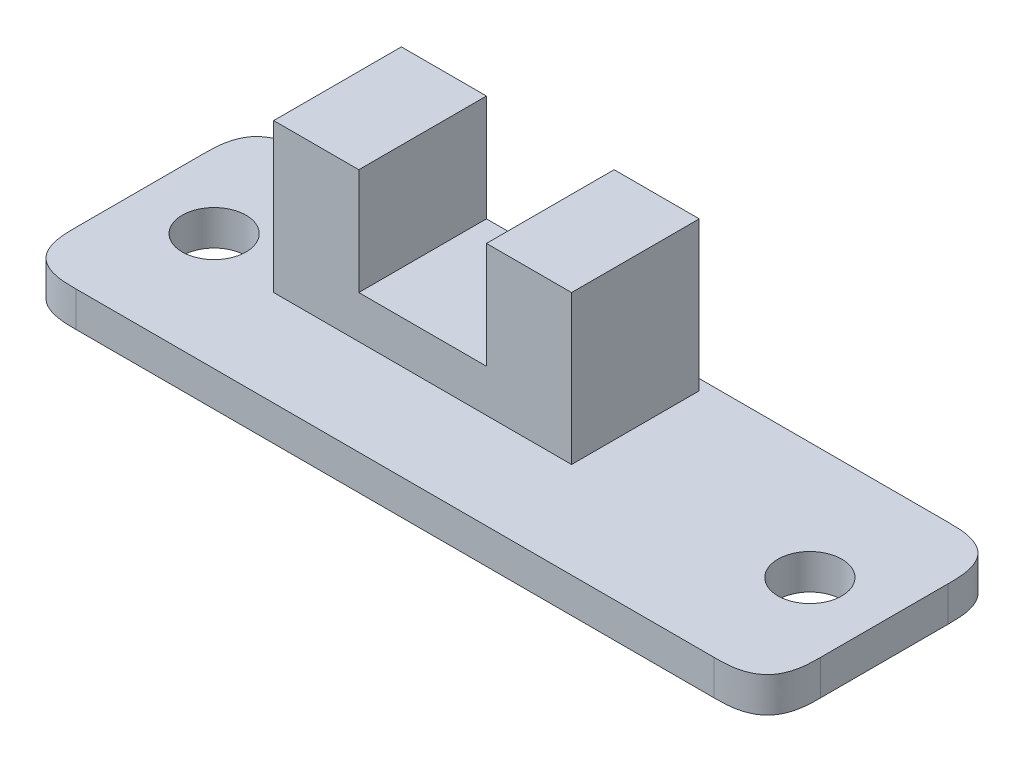
ISO-10303-21;
HEADER;
FILE_DESCRIPTION(('STEP AP214'),'2;1');
FILE_NAME('part.step','',(''),(''),'','','');
FILE_SCHEMA(('AUTOMOTIVE_DESIGN { 1 0 10303 214 1 1 1 1 }'));
ENDSEC;
DATA;
#1=APPLICATION_CONTEXT('core data for automotive mechanical design processes');
#2=APPLICATION_PROTOCOL_DEFINITION('international standard','automotive_design',2000,#1);
#3=PRODUCT_CONTEXT('',#1,'mechanical');
#4=PRODUCT('Part','Part','',(#3));
#5=PRODUCT_RELATED_PRODUCT_CATEGORY('part','',(#4));
#6=PRODUCT_DEFINITION_FORMATION('','',#4);
#7=PRODUCT_DEFINITION_CONTEXT('part definition',#1,'design');
#8=PRODUCT_DEFINITION('design','',#6,#7);
#9=PRODUCT_DEFINITION_SHAPE('','',#8);
#10=(LENGTH_UNIT() NAMED_UNIT(*) SI_UNIT(.MILLI.,.METRE.));
#11=(NAMED_UNIT(*) PLANE_ANGLE_UNIT() SI_UNIT($,.RADIAN.));
#12=(NAMED_UNIT(*) SI_UNIT($,.STERADIAN.) SOLID_ANGLE_UNIT());
#13=UNCERTAINTY_MEASURE_WITH_UNIT(LENGTH_MEASURE(1.E-05),#10,'distance_accuracy_value','');
#14=(GEOMETRIC_REPRESENTATION_CONTEXT(3) GLOBAL_UNCERTAINTY_ASSIGNED_CONTEXT((#13)) GLOBAL_UNIT_ASSIGNED_CONTEXT((#10,
#11,#12)) REPRESENTATION_CONTEXT('',''));
#15=CARTESIAN_POINT('',(0.,0.,0.));
#16=DIRECTION('',(0.,0.,1.));
#17=DIRECTION('',(1.,0.,0.));
#18=AXIS2_PLACEMENT_3D('',#15,#16,#17);
#19=CARTESIAN_POINT('',(0.,1.65,0.));
#20=DIRECTION('',(0.,-1.,0.));
#21=DIRECTION('',(0.,0.,-1.));
#22=AXIS2_PLACEMENT_3D('',#19,#20,#21);
#23=PLANE('',#22);
#24=DIRECTION('',(1.,0.,0.));
#25=VECTOR('',#24,1.);
#26=CARTESIAN_POINT('',(0.,1.65,-10.5));
#27=LINE('',#26,#25);
#28=CARTESIAN_POINT('',(7.3,1.65,-10.5));
#29=VERTEX_POINT('',#28);
#30=CARTESIAN_POINT('',(21.3,1.65,-10.5));
#31=VERTEX_POINT('',#30);
#32=EDGE_CURVE('E98',#29,#31,#27,.T.);
#33=ORIENTED_EDGE('',*,*,#32,.T.);
#34=DIRECTION('',(0.,0.,1.));
#35=VECTOR('',#34,1.);
#36=CARTESIAN_POINT('',(21.3,1.65,0.));
#37=LINE('',#36,#35);
#38=CARTESIAN_POINT('',(21.3,1.65,-4.5));
#39=VERTEX_POINT('',#38);
#40=EDGE_CURVE('E237',#31,#39,#37,.T.);
#41=ORIENTED_EDGE('',*,*,#40,.T.);
#42=DIRECTION('',(1.,0.,0.));
#43=VECTOR('',#42,1.);
#44=CARTESIAN_POINT('',(0.,1.65,-4.5));
#45=LINE('',#44,#43);
#46=CARTESIAN_POINT('',(7.3,1.65,-4.5));
#47=VERTEX_POINT('',#46);
#48=EDGE_CURVE('E243',#47,#39,#45,.T.);
#49=ORIENTED_EDGE('',*,*,#48,.F.);
#50=DIRECTION('',(0.,0.,1.));
#51=VECTOR('',#50,1.);
#52=CARTESIAN_POINT('',(7.3,1.65,0.));
#53=LINE('',#52,#51);
#54=EDGE_CURVE('E246',#29,#47,#53,.T.);
#55=ORIENTED_EDGE('',*,*,#54,.F.);
#56=EDGE_LOOP('',(#33,#41,#49,#55));
#57=FACE_BOUND('',#56,.T.);
#58=DIRECTION('',(1.,0.,0.));
#59=VECTOR('',#58,1.);
#60=CARTESIAN_POINT('',(0.,1.65,-11.));
#61=LINE('',#60,#59);
#62=CARTESIAN_POINT('',(2.5,1.65,-11.));
#63=VERTEX_POINT('',#62);
#64=CARTESIAN_POINT('',(32.5,1.65,-11.));
#65=VERTEX_POINT('',#64);
#66=EDGE_CURVE('E282',#63,#65,#61,.T.);
#67=ORIENTED_EDGE('',*,*,#66,.F.);
#68=CARTESIAN_POINT('',(0.,1.65,-8.5));
#69=CARTESIAN_POINT('',(0.,1.65,-8.92049512883487));
#70=CARTESIAN_POINT('',(0.,1.65,-9.34099025766973));
#71=CARTESIAN_POINT('',(0.179229799590208,1.65,-10.2677669529664));
#72=CARTESIAN_POINT('',(0.732233047033631,1.65,-10.8207702004098));
#73=CARTESIAN_POINT('',(1.65900974233027,1.65,-11.));
#74=CARTESIAN_POINT('',(2.07950487116513,1.65,-11.));
#75=CARTESIAN_POINT('',(2.5,1.65,-11.));
#76=B_SPLINE_CURVE_WITH_KNOTS('',5,(#68,#69,#70,#71,#72,#73,#74,#75),.UNSPECIFIED.,.F.,.F.,(6,2,
6),(0.,0.5,1.),.UNSPECIFIED.);
#77=CARTESIAN_POINT('',(0.,1.65,-8.5));
#78=VERTEX_POINT('',#77);
#79=EDGE_CURVE('E465',#63,#78,#76,.F.);
#80=ORIENTED_EDGE('',*,*,#79,.T.);
#81=DIRECTION('',(0.,0.,-1.));
#82=VECTOR('',#81,1.);
#83=CARTESIAN_POINT('',(0.,1.65,0.));
#84=LINE('',#83,#82);
#85=CARTESIAN_POINT('',(0.,1.65,-2.5));
#86=VERTEX_POINT('',#85);
#87=EDGE_CURVE('E278',#86,#78,#84,.T.);
#88=ORIENTED_EDGE('',*,*,#87,.F.);
#89=CARTESIAN_POINT('',(2.5,1.65,0.));
#90=CARTESIAN_POINT('',(2.07950487116513,1.65,0.));
#91=CARTESIAN_POINT('',(1.65900974233027,1.65,0.));
#92=CARTESIAN_POINT('',(0.732233047033631,1.65,-0.179229799590208));
#93=CARTESIAN_POINT('',(0.179229799590208,1.65,-0.732233047033631));
#94=CARTESIAN_POINT('',(0.,1.65,-1.65900974233027));
#95=CARTESIAN_POINT('',(0.,1.65,-2.07950487116513));
#96=CARTESIAN_POINT('',(0.,1.65,-2.5));
#97=B_SPLINE_CURVE_WITH_KNOTS('',5,(#89,#90,#91,#92,#93,#94,#95,#96),.UNSPECIFIED.,.F.,.F.,(6,2,
6),(0.,0.5,1.),.UNSPECIFIED.);
#98=CARTESIAN_POINT('',(2.5,1.65,0.));
#99=VERTEX_POINT('',#98);
#100=EDGE_CURVE('E442',#86,#99,#97,.F.);
#101=ORIENTED_EDGE('',*,*,#100,.T.);
#102=DIRECTION('',(1.,0.,0.));
#103=VECTOR('',#102,1.);
#104=CARTESIAN_POINT('',(0.,1.65,0.));
#105=LINE('',#104,#103);
#106=CARTESIAN_POINT('',(32.5,1.65,0.));
#107=VERTEX_POINT('',#106);
#108=EDGE_CURVE('E415',#99,#107,#105,.T.);
#109=ORIENTED_EDGE('',*,*,#108,.T.);
#110=CARTESIAN_POINT('',(35.,1.65,-2.5));
#111=CARTESIAN_POINT('',(35.,1.65,-2.07950487116513));
#112=CARTESIAN_POINT('',(35.,1.65,-1.65900974233027));
#113=CARTESIAN_POINT('',(34.8207702004098,1.65,-0.732233047033631));
#114=CARTESIAN_POINT('',(34.2677669529664,1.65,-0.179229799590209));
#115=CARTESIAN_POINT('',(33.3409902576697,1.65,0.));
#116=CARTESIAN_POINT('',(32.9204951288349,1.65,0.));
#117=CARTESIAN_POINT('',(32.5,1.65,0.));
#118=B_SPLINE_CURVE_WITH_KNOTS('',5,(#110,#111,#112,#113,#114,#115,#116,#117),.UNSPECIFIED.,.F.,
.F.,(6,2,6),(0.,0.5,1.),.UNSPECIFIED.);
#119=CARTESIAN_POINT('',(35.,1.65,-2.5));
#120=VERTEX_POINT('',#119);
#121=EDGE_CURVE('E430',#107,#120,#118,.F.);
#122=ORIENTED_EDGE('',*,*,#121,.T.);
#123=DIRECTION('',(0.,0.,-1.));
#124=VECTOR('',#123,1.);
#125=CARTESIAN_POINT('',(35.,1.65,0.));
#126=LINE('',#125,#124);
#127=CARTESIAN_POINT('',(35.,1.65,-8.5));
#128=VERTEX_POINT('',#127);
#129=EDGE_CURVE('E394',#120,#128,#126,.T.);
#130=ORIENTED_EDGE('',*,*,#129,.T.);
#131=CARTESIAN_POINT('',(32.5,1.65,-11.));
#132=CARTESIAN_POINT('',(32.9204951288349,1.65,-11.));
#133=CARTESIAN_POINT('',(33.3409902576697,1.65,-11.));
#134=CARTESIAN_POINT('',(34.2677669529664,1.65,-10.8207702004098));
#135=CARTESIAN_POINT('',(34.8207702004098,1.65,-10.2677669529664));
#136=CARTESIAN_POINT('',(35.,1.65,-9.34099025766973));
#137=CARTESIAN_POINT('',(35.,1.65,-8.92049512883487));
#138=CARTESIAN_POINT('',(35.,1.65,-8.5));
#139=B_SPLINE_CURVE_WITH_KNOTS('',5,(#131,#132,#133,#134,#135,#136,#137,#138),.UNSPECIFIED.,.F.,
.F.,(6,2,6),(0.,0.5,1.),.UNSPECIFIED.);
#140=EDGE_CURVE('E454',#128,#65,#139,.F.);
#141=ORIENTED_EDGE('',*,*,#140,.T.);
#142=EDGE_LOOP('',(#67,#80,#88,#101,#109,#122,#130,#141));
#143=FACE_BOUND('',#142,.T.);
#144=CARTESIAN_POINT('',(3.5,1.65,-5.5));
#145=DIRECTION('',(0.,1.,0.));
#146=DIRECTION('',(0.,0.,1.));
#147=AXIS2_PLACEMENT_3D('',#144,#145,#146);
#148=CIRCLE('',#147,1.5);
#149=CARTESIAN_POINT('',(3.5,1.65,-4.));
#150=VERTEX_POINT('',#149);
#151=EDGE_CURVE('E267',#150,#150,#148,.T.);
#152=ORIENTED_EDGE('',*,*,#151,.F.);
#153=EDGE_LOOP('',(#152));
#154=FACE_BOUND('',#153,.T.);
#155=CARTESIAN_POINT('',(31.5,1.65,-5.5));
#156=DIRECTION('',(0.,1.,0.));
#157=DIRECTION('',(0.,0.,1.));
#158=AXIS2_PLACEMENT_3D('',#155,#156,#157);
#159=CIRCLE('',#158,1.5);
#160=CARTESIAN_POINT('',(31.5,1.65,-4.));
#161=VERTEX_POINT('',#160);
#162=EDGE_CURVE('E261',#161,#161,#159,.T.);
#163=ORIENTED_EDGE('',*,*,#162,.F.);
#164=EDGE_LOOP('',(#163));
#165=FACE_BOUND('',#164,.T.);
#166=ADVANCED_FACE('F69',(#57,#143,#154,#165),#23,.F.);
#167=CARTESIAN_POINT('',(0.,0.,0.));
#168=DIRECTION('',(0.,-1.,0.));
#169=DIRECTION('',(0.,0.,-1.));
#170=AXIS2_PLACEMENT_3D('',#167,#168,#169);
#171=PLANE('',#170);
#172=CARTESIAN_POINT('',(3.5,0.,-5.5));
#173=DIRECTION('',(0.,1.,0.));
#174=DIRECTION('',(0.,0.,1.));
#175=AXIS2_PLACEMENT_3D('',#172,#173,#174);
#176=CIRCLE('',#175,1.5);
#177=CARTESIAN_POINT('',(3.5,0.,-4.));
#178=VERTEX_POINT('',#177);
#179=EDGE_CURVE('E264',#178,#178,#176,.T.);
#180=ORIENTED_EDGE('',*,*,#179,.T.);
#181=EDGE_LOOP('',(#180));
#182=FACE_BOUND('',#181,.T.);
#183=DIRECTION('',(0.,0.,-1.));
#184=VECTOR('',#183,1.);
#185=CARTESIAN_POINT('',(0.,0.,0.));
#186=LINE('',#185,#184);
#187=CARTESIAN_POINT('',(0.,0.,-2.5));
#188=VERTEX_POINT('',#187);
#189=CARTESIAN_POINT('',(0.,0.,-8.5));
#190=VERTEX_POINT('',#189);
#191=EDGE_CURVE('E270',#188,#190,#186,.T.);
#192=ORIENTED_EDGE('',*,*,#191,.T.);
#193=CARTESIAN_POINT('',(2.5,0.,-11.));
#194=CARTESIAN_POINT('',(2.07950487116513,0.,-11.));
#195=CARTESIAN_POINT('',(1.65900974233027,0.,-11.));
#196=CARTESIAN_POINT('',(0.732233047033631,0.,-10.8207702004098));
#197=CARTESIAN_POINT('',(0.179229799590208,0.,-10.2677669529664));
#198=CARTESIAN_POINT('',(0.,0.,-9.34099025766973));
#199=CARTESIAN_POINT('',(0.,0.,-8.92049512883487));
#200=CARTESIAN_POINT('',(0.,0.,-8.5));
#201=B_SPLINE_CURVE_WITH_KNOTS('',5,(#193,#194,#195,#196,#197,#198,#199,#200),.UNSPECIFIED.,.F.,
.F.,(6,2,6),(0.,0.5,1.),.UNSPECIFIED.);
#202=CARTESIAN_POINT('',(2.5,0.,-11.));
#203=VERTEX_POINT('',#202);
#204=EDGE_CURVE('E382',#190,#203,#201,.F.);
#205=ORIENTED_EDGE('',*,*,#204,.T.);
#206=DIRECTION('',(1.,0.,0.));
#207=VECTOR('',#206,1.);
#208=CARTESIAN_POINT('',(0.,0.,-11.));
#209=LINE('',#208,#207);
#210=CARTESIAN_POINT('',(32.5,0.,-11.));
#211=VERTEX_POINT('',#210);
#212=EDGE_CURVE('E323',#203,#211,#209,.T.);
#213=ORIENTED_EDGE('',*,*,#212,.T.);
#214=CARTESIAN_POINT('',(35.,0.,-8.5));
#215=CARTESIAN_POINT('',(35.,0.,-8.92049512883486));
#216=CARTESIAN_POINT('',(35.,0.,-9.34099025766973));
#217=CARTESIAN_POINT('',(34.8207702004098,0.,-10.2677669529664));
#218=CARTESIAN_POINT('',(34.2677669529664,0.,-10.8207702004098));
#219=CARTESIAN_POINT('',(33.3409902576697,0.,-11.));
#220=CARTESIAN_POINT('',(32.9204951288349,0.,-11.));
#221=CARTESIAN_POINT('',(32.5,0.,-11.));
#222=B_SPLINE_CURVE_WITH_KNOTS('',5,(#214,#215,#216,#217,#218,#219,#220,#221),.UNSPECIFIED.,.F.,
.F.,(6,2,6),(0.,0.5,1.),.UNSPECIFIED.);
#223=CARTESIAN_POINT('',(35.,0.,-8.5));
#224=VERTEX_POINT('',#223);
#225=EDGE_CURVE('E564',#211,#224,#222,.F.);
#226=ORIENTED_EDGE('',*,*,#225,.T.);
#227=DIRECTION('',(0.,0.,-1.));
#228=VECTOR('',#227,1.);
#229=CARTESIAN_POINT('',(35.,0.,0.));
#230=LINE('',#229,#228);
#231=CARTESIAN_POINT('',(35.,0.,-2.5));
#232=VERTEX_POINT('',#231);
#233=EDGE_CURVE('E332',#232,#224,#230,.T.);
#234=ORIENTED_EDGE('',*,*,#233,.F.);
#235=CARTESIAN_POINT('',(32.5,0.,0.));
#236=CARTESIAN_POINT('',(32.9204951288349,0.,0.));
#237=CARTESIAN_POINT('',(33.3409902576697,0.,0.));
#238=CARTESIAN_POINT('',(34.2677669529664,0.,-0.179229799590209));
#239=CARTESIAN_POINT('',(34.8207702004098,0.,-0.732233047033631));
#240=CARTESIAN_POINT('',(35.,0.,-1.65900974233027));
#241=CARTESIAN_POINT('',(35.,0.,-2.07950487116513));
#242=CARTESIAN_POINT('',(35.,0.,-2.5));
#243=B_SPLINE_CURVE_WITH_KNOTS('',5,(#235,#236,#237,#238,#239,#240,#241,#242),.UNSPECIFIED.,.F.,
.F.,(6,2,6),(0.,0.5,1.),.UNSPECIFIED.);
#244=CARTESIAN_POINT('',(32.5,0.,0.));
#245=VERTEX_POINT('',#244);
#246=EDGE_CURVE('E346',#232,#245,#243,.F.);
#247=ORIENTED_EDGE('',*,*,#246,.T.);
#248=DIRECTION('',(1.,0.,0.));
#249=VECTOR('',#248,1.);
#250=CARTESIAN_POINT('',(0.,0.,0.));
#251=LINE('',#250,#249);
#252=CARTESIAN_POINT('',(2.5,0.,0.));
#253=VERTEX_POINT('',#252);
#254=EDGE_CURVE('E283',#253,#245,#251,.T.);
#255=ORIENTED_EDGE('',*,*,#254,.F.);
#256=CARTESIAN_POINT('',(0.,0.,-2.5));
#257=CARTESIAN_POINT('',(0.,0.,-2.07950487116513));
#258=CARTESIAN_POINT('',(0.,0.,-1.65900974233027));
#259=CARTESIAN_POINT('',(0.179229799590208,0.,-0.732233047033631));
#260=CARTESIAN_POINT('',(0.732233047033631,0.,-0.179229799590208));
#261=CARTESIAN_POINT('',(1.65900974233027,0.,0.));
#262=CARTESIAN_POINT('',(2.07950487116513,0.,0.));
#263=CARTESIAN_POINT('',(2.5,0.,0.));
#264=B_SPLINE_CURVE_WITH_KNOTS('',5,(#256,#257,#258,#259,#260,#261,#262,#263),.UNSPECIFIED.,.F.,
.F.,(6,2,6),(0.,0.5,1.),.UNSPECIFIED.);
#265=EDGE_CURVE('E619',#253,#188,#264,.F.);
#266=ORIENTED_EDGE('',*,*,#265,.T.);
#267=EDGE_LOOP('',(#192,#205,#213,#226,#234,#247,#255,#266));
#268=FACE_BOUND('',#267,.T.);
#269=CARTESIAN_POINT('',(31.5,0.,-5.5));
#270=DIRECTION('',(0.,1.,0.));
#271=DIRECTION('',(0.,0.,1.));
#272=AXIS2_PLACEMENT_3D('',#269,#270,#271);
#273=CIRCLE('',#272,1.5);
#274=CARTESIAN_POINT('',(31.5,0.,-4.));
#275=VERTEX_POINT('',#274);
#276=EDGE_CURVE('E252',#275,#275,#273,.T.);
#277=ORIENTED_EDGE('',*,*,#276,.T.);
#278=EDGE_LOOP('',(#277));
#279=FACE_BOUND('',#278,.T.);
#280=ADVANCED_FACE('F309',(#182,#268,#279),#171,.T.);
#281=CARTESIAN_POINT('',(0.,1.65,0.));
#282=DIRECTION('',(-1.,0.,0.));
#283=DIRECTION('',(0.,0.,1.));
#284=AXIS2_PLACEMENT_3D('',#281,#282,#283);
#285=PLANE('',#284);
#286=ORIENTED_EDGE('',*,*,#87,.T.);
#287=CARTESIAN_POINT('',(0.,-0.0825000000000005,-8.5));
#288=CARTESIAN_POINT('',(0.,0.5225,-8.5));
#289=CARTESIAN_POINT('',(0.,1.12749999999985,-8.5));
#290=CARTESIAN_POINT('',(0.,1.7325,-8.5));
#291=B_SPLINE_CURVE_WITH_KNOTS('',3,(#287,#288,#289,#290),.UNSPECIFIED.,.F.,.F.,(4,4),
(-8.25000000000001E-05,0.0017325),.UNSPECIFIED.);
#292=EDGE_CURVE('E534',#78,#190,#291,.F.);
#293=ORIENTED_EDGE('',*,*,#292,.T.);
#294=ORIENTED_EDGE('',*,*,#191,.F.);
#295=CARTESIAN_POINT('',(0.,1.7325,-2.5));
#296=CARTESIAN_POINT('',(0.,1.12750000000011,-2.5));
#297=CARTESIAN_POINT('',(0.,0.5225,-2.5));
#298=CARTESIAN_POINT('',(0.,-0.0825000000000001,-2.5));
#299=B_SPLINE_CURVE_WITH_KNOTS('',3,(#295,#296,#297,#298),.UNSPECIFIED.,.F.,.F.,(4,4),
(-0.0017325,8.25000000000001E-05),.UNSPECIFIED.);
#300=EDGE_CURVE('E290',#188,#86,#299,.F.);
#301=ORIENTED_EDGE('',*,*,#300,.T.);
#302=EDGE_LOOP('',(#286,#293,#294,#301));
#303=FACE_BOUND('',#302,.T.);
#304=ADVANCED_FACE('F298',(#303),#285,.T.);
#305=CARTESIAN_POINT('',(0.,1.65,0.));
#306=DIRECTION('',(0.,0.,-1.));
#307=DIRECTION('',(-1.,0.,0.));
#308=AXIS2_PLACEMENT_3D('',#305,#306,#307);
#309=PLANE('',#308);
#310=ORIENTED_EDGE('',*,*,#108,.F.);
#311=CARTESIAN_POINT('',(2.5,-0.0825000000000001,0.));
#312=CARTESIAN_POINT('',(2.5,0.5225,0.));
#313=CARTESIAN_POINT('',(2.5,1.12750000000011,0.));
#314=CARTESIAN_POINT('',(2.5,1.7325,0.));
#315=B_SPLINE_CURVE_WITH_KNOTS('',3,(#311,#312,#313,#314),.UNSPECIFIED.,.F.,.F.,(4,4),
(-0.0017325,8.25E-05),.UNSPECIFIED.);
#316=EDGE_CURVE('E12',#99,#253,#315,.F.);
#317=ORIENTED_EDGE('',*,*,#316,.T.);
#318=ORIENTED_EDGE('',*,*,#254,.T.);
#319=CARTESIAN_POINT('',(32.5,1.7325,0.));
#320=CARTESIAN_POINT('',(32.5,1.12749999999985,0.));
#321=CARTESIAN_POINT('',(32.5,0.5225,0.));
#322=CARTESIAN_POINT('',(32.5,-0.0825000000000005,0.));
#323=B_SPLINE_CURVE_WITH_KNOTS('',3,(#319,#320,#321,#322),.UNSPECIFIED.,.F.,.F.,(4,4),
(-8.25E-05,0.0017325),.UNSPECIFIED.);
#324=EDGE_CURVE('E83',#245,#107,#323,.F.);
#325=ORIENTED_EDGE('',*,*,#324,.T.);
#326=EDGE_LOOP('',(#310,#317,#318,#325));
#327=FACE_BOUND('',#326,.T.);
#328=ADVANCED_FACE('F308',(#327),#309,.F.);
#329=CARTESIAN_POINT('',(35.,1.65,0.));
#330=DIRECTION('',(-1.,0.,0.));
#331=DIRECTION('',(0.,0.,1.));
#332=AXIS2_PLACEMENT_3D('',#329,#330,#331);
#333=PLANE('',#332);
#334=ORIENTED_EDGE('',*,*,#233,.T.);
#335=CARTESIAN_POINT('',(35.,1.7325,-8.5));
#336=CARTESIAN_POINT('',(35.,1.12750000000011,-8.5));
#337=CARTESIAN_POINT('',(35.,0.5225,-8.5));
#338=CARTESIAN_POINT('',(35.,-0.0825000000000001,-8.5));
#339=B_SPLINE_CURVE_WITH_KNOTS('',3,(#335,#336,#337,#338),.UNSPECIFIED.,.F.,.F.,(4,4),
(-0.0017325,8.25000000000001E-05),.UNSPECIFIED.);
#340=EDGE_CURVE('E608',#224,#128,#339,.F.);
#341=ORIENTED_EDGE('',*,*,#340,.T.);
#342=ORIENTED_EDGE('',*,*,#129,.F.);
#343=CARTESIAN_POINT('',(35.,-0.0825000000000005,-2.5));
#344=CARTESIAN_POINT('',(35.,0.5225,-2.5));
#345=CARTESIAN_POINT('',(35.,1.12749999999985,-2.5));
#346=CARTESIAN_POINT('',(35.,1.7325,-2.5));
#347=B_SPLINE_CURVE_WITH_KNOTS('',3,(#343,#344,#345,#346),.UNSPECIFIED.,.F.,.F.,(4,4),
(-8.25000000000001E-05,0.0017325),.UNSPECIFIED.);
#348=EDGE_CURVE('E479',#120,#232,#347,.F.);
#349=ORIENTED_EDGE('',*,*,#348,.T.);
#350=EDGE_LOOP('',(#334,#341,#342,#349));
#351=FACE_BOUND('',#350,.T.);
#352=ADVANCED_FACE('F484',(#351),#333,.F.);
#353=CARTESIAN_POINT('',(0.,1.65,-11.));
#354=DIRECTION('',(0.,0.,-1.));
#355=DIRECTION('',(-1.,0.,0.));
#356=AXIS2_PLACEMENT_3D('',#353,#354,#355);
#357=PLANE('',#356);
#358=ORIENTED_EDGE('',*,*,#212,.F.);
#359=CARTESIAN_POINT('',(2.5,1.7325,-11.));
#360=CARTESIAN_POINT('',(2.5,1.12749999999985,-11.));
#361=CARTESIAN_POINT('',(2.5,0.5225,-11.));
#362=CARTESIAN_POINT('',(2.5,-0.0825000000000005,-11.));
#363=B_SPLINE_CURVE_WITH_KNOTS('',3,(#359,#360,#361,#362),.UNSPECIFIED.,.F.,.F.,(4,4),
(-8.25E-05,0.0017325),.UNSPECIFIED.);
#364=EDGE_CURVE('E410',#203,#63,#363,.F.);
#365=ORIENTED_EDGE('',*,*,#364,.T.);
#366=ORIENTED_EDGE('',*,*,#66,.T.);
#367=CARTESIAN_POINT('',(32.5,-0.0825000000000001,-11.));
#368=CARTESIAN_POINT('',(32.5,0.5225,-11.));
#369=CARTESIAN_POINT('',(32.5,1.12750000000011,-11.));
#370=CARTESIAN_POINT('',(32.5,1.7325,-11.));
#371=B_SPLINE_CURVE_WITH_KNOTS('',3,(#367,#368,#369,#370),.UNSPECIFIED.,.F.,.F.,(4,4),
(-0.0017325,8.25E-05),.UNSPECIFIED.);
#372=EDGE_CURVE('E399',#65,#211,#371,.F.);
#373=ORIENTED_EDGE('',*,*,#372,.T.);
#374=EDGE_LOOP('',(#358,#365,#366,#373));
#375=FACE_BOUND('',#374,.T.);
#376=ADVANCED_FACE('F310',(#375),#357,.T.);
#377=CARTESIAN_POINT('',(3.5,1.65,-5.5));
#378=DIRECTION('',(0.,-1.,0.));
#379=DIRECTION('',(0.,0.,-1.));
#380=AXIS2_PLACEMENT_3D('',#377,#378,#379);
#381=CYLINDRICAL_SURFACE('',#380,1.5);
#382=ORIENTED_EDGE('',*,*,#151,.T.);
#383=EDGE_LOOP('',(#382));
#384=FACE_BOUND('',#383,.T.);
#385=ORIENTED_EDGE('',*,*,#179,.F.);
#386=EDGE_LOOP('',(#385));
#387=FACE_BOUND('',#386,.T.);
#388=ADVANCED_FACE('F687',(#384,#387),#381,.F.);
#389=CARTESIAN_POINT('',(31.5,1.65,-5.5));
#390=DIRECTION('',(0.,-1.,0.));
#391=DIRECTION('',(0.,0.,-1.));
#392=AXIS2_PLACEMENT_3D('',#389,#390,#391);
#393=CYLINDRICAL_SURFACE('',#392,1.5);
#394=ORIENTED_EDGE('',*,*,#162,.T.);
#395=EDGE_LOOP('',(#394));
#396=FACE_BOUND('',#395,.T.);
#397=ORIENTED_EDGE('',*,*,#276,.F.);
#398=EDGE_LOOP('',(#397));
#399=FACE_BOUND('',#398,.T.);
#400=ADVANCED_FACE('F685',(#396,#399),#393,.F.);
#401=CARTESIAN_POINT('',(0.,1.7325,-8.5));
#402=CARTESIAN_POINT('',(0.,1.12749999999985,-8.5));
#403=CARTESIAN_POINT('',(0.,0.5225,-8.5));
#404=CARTESIAN_POINT('',(0.,-0.0825000000000005,-8.5));
#405=CARTESIAN_POINT('',(0.,1.7325,-8.92049512883487));
#406=CARTESIAN_POINT('',(0.,1.12749999999985,-8.92049512883487));
#407=CARTESIAN_POINT('',(0.,0.5225,-8.92049512883487));
#408=CARTESIAN_POINT('',(0.,-0.0825000000000005,-8.92049512883487));
#409=CARTESIAN_POINT('',(0.,1.7325,-9.34099025766973));
#410=CARTESIAN_POINT('',(0.,1.12749999999985,-9.34099025766973));
#411=CARTESIAN_POINT('',(0.,0.5225,-9.34099025766973));
#412=CARTESIAN_POINT('',(0.,-0.0825000000000005,-9.34099025766973));
#413=CARTESIAN_POINT('',(0.179229799590208,1.7325,-10.2677669529664));
#414=CARTESIAN_POINT('',(0.179229799590208,1.12749999999985,-10.2677669529664));
#415=CARTESIAN_POINT('',(0.179229799590208,0.5225,-10.2677669529664));
#416=CARTESIAN_POINT('',(0.179229799590208,-0.0825000000000005,-10.2677669529664));
#417=CARTESIAN_POINT('',(0.732233047033631,1.7325,-10.8207702004098));
#418=CARTESIAN_POINT('',(0.732233047033631,1.12749999999985,-10.8207702004098));
#419=CARTESIAN_POINT('',(0.732233047033631,0.5225,-10.8207702004098));
#420=CARTESIAN_POINT('',(0.732233047033631,-0.0825000000000005,-10.8207702004098));
#421=CARTESIAN_POINT('',(1.65900974233027,1.7325,-11.));
#422=CARTESIAN_POINT('',(1.65900974233027,1.12749999999985,-11.));
#423=CARTESIAN_POINT('',(1.65900974233027,0.5225,-11.));
#424=CARTESIAN_POINT('',(1.65900974233027,-0.0825000000000005,-11.));
#425=CARTESIAN_POINT('',(2.07950487116513,1.7325,-11.));
#426=CARTESIAN_POINT('',(2.07950487116513,1.12749999999985,-11.));
#427=CARTESIAN_POINT('',(2.07950487116513,0.5225,-11.));
#428=CARTESIAN_POINT('',(2.07950487116513,-0.0825000000000005,-11.));
#429=CARTESIAN_POINT('',(2.5,1.7325,-11.));
#430=CARTESIAN_POINT('',(2.5,1.12749999999985,-11.));
#431=CARTESIAN_POINT('',(2.5,0.5225,-11.));
#432=CARTESIAN_POINT('',(2.5,-0.0825000000000005,-11.));
#433=B_SPLINE_SURFACE_WITH_KNOTS('',5,3,((#401,#402,#403,#404),(#405,#406,#407,#408),(#409,#410,
#411,#412),(#413,#414,#415,#416),(#417,#418,#419,#420),(#421,#422,#423,#424),(#425,#426,#427,
#428),(#429,#430,#431,#432)),.UNSPECIFIED.,.F.,.F.,.F.,(6,2,6),(4,4),(0.,0.5,1.),(-8.25E-05,
0.0017325),.UNSPECIFIED.);
#434=ORIENTED_EDGE('',*,*,#79,.F.);
#435=ORIENTED_EDGE('',*,*,#364,.F.);
#436=ORIENTED_EDGE('',*,*,#204,.F.);
#437=ORIENTED_EDGE('',*,*,#292,.F.);
#438=EDGE_LOOP('',(#434,#435,#436,#437));
#439=FACE_BOUND('',#438,.T.);
#440=ADVANCED_FACE('F314',(#439),#433,.T.);
#441=CARTESIAN_POINT('',(35.,-0.0825000000000001,-8.5));
#442=CARTESIAN_POINT('',(35.,0.5225,-8.5));
#443=CARTESIAN_POINT('',(35.,1.12750000000011,-8.5));
#444=CARTESIAN_POINT('',(35.,1.7325,-8.5));
#445=CARTESIAN_POINT('',(35.,-0.0825000000000001,-8.92049512883487));
#446=CARTESIAN_POINT('',(35.,0.5225,-8.92049512883487));
#447=CARTESIAN_POINT('',(35.,1.12750000000011,-8.92049512883487));
#448=CARTESIAN_POINT('',(35.,1.7325,-8.92049512883487));
#449=CARTESIAN_POINT('',(35.,-0.0825000000000001,-9.34099025766973));
#450=CARTESIAN_POINT('',(35.,0.5225,-9.34099025766973));
#451=CARTESIAN_POINT('',(35.,1.12750000000011,-9.34099025766973));
#452=CARTESIAN_POINT('',(35.,1.7325,-9.34099025766973));
#453=CARTESIAN_POINT('',(34.8207702004098,-0.0825000000000001,-10.2677669529664));
#454=CARTESIAN_POINT('',(34.8207702004098,0.5225,-10.2677669529664));
#455=CARTESIAN_POINT('',(34.8207702004098,1.12750000000011,-10.2677669529664));
#456=CARTESIAN_POINT('',(34.8207702004098,1.7325,-10.2677669529664));
#457=CARTESIAN_POINT('',(34.2677669529664,-0.0825000000000001,-10.8207702004098));
#458=CARTESIAN_POINT('',(34.2677669529664,0.5225,-10.8207702004098));
#459=CARTESIAN_POINT('',(34.2677669529664,1.12750000000011,-10.8207702004098));
#460=CARTESIAN_POINT('',(34.2677669529664,1.7325,-10.8207702004098));
#461=CARTESIAN_POINT('',(33.3409902576697,-0.0825000000000001,-11.));
#462=CARTESIAN_POINT('',(33.3409902576697,0.5225,-11.));
#463=CARTESIAN_POINT('',(33.3409902576697,1.12750000000011,-11.));
#464=CARTESIAN_POINT('',(33.3409902576697,1.7325,-11.));
#465=CARTESIAN_POINT('',(32.9204951288349,-0.0825000000000001,-11.));
#466=CARTESIAN_POINT('',(32.9204951288349,0.5225,-11.));
#467=CARTESIAN_POINT('',(32.9204951288349,1.12750000000011,-11.));
#468=CARTESIAN_POINT('',(32.9204951288349,1.7325,-11.));
#469=CARTESIAN_POINT('',(32.5,-0.0825000000000001,-11.));
#470=CARTESIAN_POINT('',(32.5,0.5225,-11.));
#471=CARTESIAN_POINT('',(32.5,1.12750000000011,-11.));
#472=CARTESIAN_POINT('',(32.5,1.7325,-11.));
#473=B_SPLINE_SURFACE_WITH_KNOTS('',5,3,((#441,#442,#443,#444),(#445,#446,#447,#448),(#449,#450,
#451,#452),(#453,#454,#455,#456),(#457,#458,#459,#460),(#461,#462,#463,#464),(#465,#466,#467,
#468),(#469,#470,#471,#472)),.UNSPECIFIED.,.F.,.F.,.F.,(6,2,6),(4,4),(0.,0.5,1.),(-0.0017325,
8.25E-05),.UNSPECIFIED.);
#474=ORIENTED_EDGE('',*,*,#140,.F.);
#475=ORIENTED_EDGE('',*,*,#340,.F.);
#476=ORIENTED_EDGE('',*,*,#225,.F.);
#477=ORIENTED_EDGE('',*,*,#372,.F.);
#478=EDGE_LOOP('',(#474,#475,#476,#477));
#479=FACE_BOUND('',#478,.T.);
#480=ADVANCED_FACE('F570',(#479),#473,.T.);
#481=CARTESIAN_POINT('',(0.,-0.0825000000000001,-2.5));
#482=CARTESIAN_POINT('',(0.,0.5225,-2.5));
#483=CARTESIAN_POINT('',(0.,1.12750000000011,-2.5));
#484=CARTESIAN_POINT('',(0.,1.7325,-2.5));
#485=CARTESIAN_POINT('',(0.,-0.0825000000000001,-2.07950487116513));
#486=CARTESIAN_POINT('',(0.,0.5225,-2.07950487116513));
#487=CARTESIAN_POINT('',(0.,1.12750000000011,-2.07950487116513));
#488=CARTESIAN_POINT('',(0.,1.7325,-2.07950487116513));
#489=CARTESIAN_POINT('',(0.,-0.0825000000000001,-1.65900974233027));
#490=CARTESIAN_POINT('',(0.,0.5225,-1.65900974233027));
#491=CARTESIAN_POINT('',(0.,1.12750000000011,-1.65900974233027));
#492=CARTESIAN_POINT('',(0.,1.7325,-1.65900974233027));
#493=CARTESIAN_POINT('',(0.179229799590208,-0.0825000000000001,-0.732233047033631));
#494=CARTESIAN_POINT('',(0.179229799590208,0.5225,-0.732233047033631));
#495=CARTESIAN_POINT('',(0.179229799590208,1.12750000000011,-0.732233047033631));
#496=CARTESIAN_POINT('',(0.179229799590208,1.7325,-0.732233047033631));
#497=CARTESIAN_POINT('',(0.732233047033631,-0.0825000000000001,-0.179229799590208));
#498=CARTESIAN_POINT('',(0.732233047033631,0.5225,-0.179229799590208));
#499=CARTESIAN_POINT('',(0.732233047033631,1.12750000000011,-0.179229799590208));
#500=CARTESIAN_POINT('',(0.732233047033631,1.7325,-0.179229799590208));
#501=CARTESIAN_POINT('',(1.65900974233027,-0.0825000000000001,0.));
#502=CARTESIAN_POINT('',(1.65900974233027,0.5225,0.));
#503=CARTESIAN_POINT('',(1.65900974233027,1.12750000000011,0.));
#504=CARTESIAN_POINT('',(1.65900974233027,1.7325,0.));
#505=CARTESIAN_POINT('',(2.07950487116513,-0.0825000000000001,0.));
#506=CARTESIAN_POINT('',(2.07950487116513,0.5225,0.));
#507=CARTESIAN_POINT('',(2.07950487116513,1.12750000000011,0.));
#508=CARTESIAN_POINT('',(2.07950487116513,1.7325,0.));
#509=CARTESIAN_POINT('',(2.5,-0.0825000000000001,0.));
#510=CARTESIAN_POINT('',(2.5,0.5225,0.));
#511=CARTESIAN_POINT('',(2.5,1.12750000000011,0.));
#512=CARTESIAN_POINT('',(2.5,1.7325,0.));
#513=B_SPLINE_SURFACE_WITH_KNOTS('',5,3,((#481,#482,#483,#484),(#485,#486,#487,#488),(#489,#490,
#491,#492),(#493,#494,#495,#496),(#497,#498,#499,#500),(#501,#502,#503,#504),(#505,#506,#507,
#508),(#509,#510,#511,#512)),.UNSPECIFIED.,.F.,.F.,.F.,(6,2,6),(4,4),(0.,0.5,1.),(-0.0017325,
8.25E-05),.UNSPECIFIED.);
#514=ORIENTED_EDGE('',*,*,#100,.F.);
#515=ORIENTED_EDGE('',*,*,#300,.F.);
#516=ORIENTED_EDGE('',*,*,#265,.F.);
#517=ORIENTED_EDGE('',*,*,#316,.F.);
#518=EDGE_LOOP('',(#514,#515,#516,#517));
#519=FACE_BOUND('',#518,.T.);
#520=ADVANCED_FACE('F583',(#519),#513,.T.);
#521=CARTESIAN_POINT('',(35.,1.7325,-2.5));
#522=CARTESIAN_POINT('',(35.,1.12749999999985,-2.5));
#523=CARTESIAN_POINT('',(35.,0.5225,-2.5));
#524=CARTESIAN_POINT('',(35.,-0.0825000000000005,-2.5));
#525=CARTESIAN_POINT('',(35.,1.7325,-2.07950487116513));
#526=CARTESIAN_POINT('',(35.,1.12749999999985,-2.07950487116513));
#527=CARTESIAN_POINT('',(35.,0.5225,-2.07950487116513));
#528=CARTESIAN_POINT('',(35.,-0.0825000000000005,-2.07950487116513));
#529=CARTESIAN_POINT('',(35.,1.7325,-1.65900974233027));
#530=CARTESIAN_POINT('',(35.,1.12749999999985,-1.65900974233027));
#531=CARTESIAN_POINT('',(35.,0.5225,-1.65900974233027));
#532=CARTESIAN_POINT('',(35.,-0.0825000000000005,-1.65900974233027));
#533=CARTESIAN_POINT('',(34.8207702004098,1.7325,-0.732233047033631));
#534=CARTESIAN_POINT('',(34.8207702004098,1.12749999999985,-0.732233047033631));
#535=CARTESIAN_POINT('',(34.8207702004098,0.5225,-0.732233047033631));
#536=CARTESIAN_POINT('',(34.8207702004098,-0.0825000000000005,-0.732233047033631));
#537=CARTESIAN_POINT('',(34.2677669529664,1.7325,-0.179229799590209));
#538=CARTESIAN_POINT('',(34.2677669529664,1.12749999999985,-0.179229799590209));
#539=CARTESIAN_POINT('',(34.2677669529664,0.5225,-0.179229799590209));
#540=CARTESIAN_POINT('',(34.2677669529664,-0.0825000000000005,-0.179229799590209));
#541=CARTESIAN_POINT('',(33.3409902576697,1.7325,0.));
#542=CARTESIAN_POINT('',(33.3409902576697,1.12749999999985,0.));
#543=CARTESIAN_POINT('',(33.3409902576697,0.5225,0.));
#544=CARTESIAN_POINT('',(33.3409902576697,-0.0825000000000005,0.));
#545=CARTESIAN_POINT('',(32.9204951288349,1.7325,0.));
#546=CARTESIAN_POINT('',(32.9204951288349,1.12749999999985,0.));
#547=CARTESIAN_POINT('',(32.9204951288349,0.5225,0.));
#548=CARTESIAN_POINT('',(32.9204951288349,-0.0825000000000005,0.));
#549=CARTESIAN_POINT('',(32.5,1.7325,0.));
#550=CARTESIAN_POINT('',(32.5,1.12749999999985,0.));
#551=CARTESIAN_POINT('',(32.5,0.5225,0.));
#552=CARTESIAN_POINT('',(32.5,-0.0825000000000005,0.));
#553=B_SPLINE_SURFACE_WITH_KNOTS('',5,3,((#521,#522,#523,#524),(#525,#526,#527,#528),(#529,#530,
#531,#532),(#533,#534,#535,#536),(#537,#538,#539,#540),(#541,#542,#543,#544),(#545,#546,#547,
#548),(#549,#550,#551,#552)),.UNSPECIFIED.,.F.,.F.,.F.,(6,2,6),(4,4),(0.,0.5,1.),(-8.25E-05,
0.0017325),.UNSPECIFIED.);
#554=ORIENTED_EDGE('',*,*,#121,.F.);
#555=ORIENTED_EDGE('',*,*,#324,.F.);
#556=ORIENTED_EDGE('',*,*,#246,.F.);
#557=ORIENTED_EDGE('',*,*,#348,.F.);
#558=EDGE_LOOP('',(#554,#555,#556,#557));
#559=FACE_BOUND('',#558,.T.);
#560=ADVANCED_FACE('F72',(#559),#553,.T.);
#561=CARTESIAN_POINT('',(21.3,3.65,0.));
#562=DIRECTION('',(1.,0.,0.));
#563=DIRECTION('',(0.,0.,-1.));
#564=AXIS2_PLACEMENT_3D('',#561,#562,#563);
#565=PLANE('',#564);
#566=ORIENTED_EDGE('',*,*,#40,.F.);
#567=DIRECTION('',(0.,-1.,0.));
#568=VECTOR('',#567,1.);
#569=CARTESIAN_POINT('',(21.3,3.65,-10.5));
#570=LINE('',#569,#568);
#571=CARTESIAN_POINT('',(21.3,8.65,-10.5));
#572=VERTEX_POINT('',#571);
#573=EDGE_CURVE('E250',#572,#31,#570,.T.);
#574=ORIENTED_EDGE('',*,*,#573,.F.);
#575=DIRECTION('',(0.,0.,-1.));
#576=VECTOR('',#575,1.);
#577=CARTESIAN_POINT('',(21.3,8.65,0.));
#578=LINE('',#577,#576);
#579=CARTESIAN_POINT('',(21.3,8.65,-4.5));
#580=VERTEX_POINT('',#579);
#581=EDGE_CURVE('E198',#580,#572,#578,.T.);
#582=ORIENTED_EDGE('',*,*,#581,.F.);
#583=DIRECTION('',(0.,-1.,0.));
#584=VECTOR('',#583,1.);
#585=CARTESIAN_POINT('',(21.3,3.65,-4.5));
#586=LINE('',#585,#584);
#587=EDGE_CURVE('E241',#580,#39,#586,.T.);
#588=ORIENTED_EDGE('',*,*,#587,.T.);
#589=EDGE_LOOP('',(#566,#574,#582,#588));
#590=FACE_BOUND('',#589,.T.);
#591=ADVANCED_FACE('F783',(#590),#565,.T.);
#592=CARTESIAN_POINT('',(0.,3.65,-10.5));
#593=DIRECTION('',(0.,0.,-1.));
#594=DIRECTION('',(-1.,0.,0.));
#595=AXIS2_PLACEMENT_3D('',#592,#593,#594);
#596=PLANE('',#595);
#597=ORIENTED_EDGE('',*,*,#32,.F.);
#598=DIRECTION('',(0.,-1.,0.));
#599=VECTOR('',#598,1.);
#600=CARTESIAN_POINT('',(7.3,3.65,-10.5));
#601=LINE('',#600,#599);
#602=CARTESIAN_POINT('',(7.3,8.65,-10.5));
#603=VERTEX_POINT('',#602);
#604=EDGE_CURVE('E253',#603,#29,#601,.T.);
#605=ORIENTED_EDGE('',*,*,#604,.F.);
#606=DIRECTION('',(-1.,0.,0.));
#607=VECTOR('',#606,1.);
#608=CARTESIAN_POINT('',(0.,8.65,-10.5));
#609=LINE('',#608,#607);
#610=CARTESIAN_POINT('',(11.3,8.65,-10.5));
#611=VERTEX_POINT('',#610);
#612=EDGE_CURVE('E220',#611,#603,#609,.T.);
#613=ORIENTED_EDGE('',*,*,#612,.F.);
#614=DIRECTION('',(0.,-1.,0.));
#615=VECTOR('',#614,1.);
#616=CARTESIAN_POINT('',(11.3,8.65,-10.5));
#617=LINE('',#616,#615);
#618=CARTESIAN_POINT('',(11.3,3.65,-10.5));
#619=VERTEX_POINT('',#618);
#620=EDGE_CURVE('E231',#611,#619,#617,.T.);
#621=ORIENTED_EDGE('',*,*,#620,.T.);
#622=DIRECTION('',(1.,0.,0.));
#623=VECTOR('',#622,1.);
#624=CARTESIAN_POINT('',(0.,3.65,-10.5));
#625=LINE('',#624,#623);
#626=CARTESIAN_POINT('',(17.3,3.65,-10.5));
#627=VERTEX_POINT('',#626);
#628=EDGE_CURVE('E206',#619,#627,#625,.T.);
#629=ORIENTED_EDGE('',*,*,#628,.T.);
#630=DIRECTION('',(0.,-1.,0.));
#631=VECTOR('',#630,1.);
#632=CARTESIAN_POINT('',(17.3,8.65,-10.5));
#633=LINE('',#632,#631);
#634=CARTESIAN_POINT('',(17.3,8.65,-10.5));
#635=VERTEX_POINT('',#634);
#636=EDGE_CURVE('E203',#635,#627,#633,.T.);
#637=ORIENTED_EDGE('',*,*,#636,.F.);
#638=DIRECTION('',(-1.,0.,0.));
#639=VECTOR('',#638,1.);
#640=CARTESIAN_POINT('',(0.,8.65,-10.5));
#641=LINE('',#640,#639);
#642=EDGE_CURVE('E190',#572,#635,#641,.T.);
#643=ORIENTED_EDGE('',*,*,#642,.F.);
#644=ORIENTED_EDGE('',*,*,#573,.T.);
#645=EDGE_LOOP('',(#597,#605,#613,#621,#629,#637,#643,#644));
#646=FACE_BOUND('',#645,.T.);
#647=ADVANCED_FACE('F204',(#646),#596,.T.);
#648=CARTESIAN_POINT('',(7.3,3.65,0.));
#649=DIRECTION('',(1.,0.,0.));
#650=DIRECTION('',(0.,0.,-1.));
#651=AXIS2_PLACEMENT_3D('',#648,#649,#650);
#652=PLANE('',#651);
#653=ORIENTED_EDGE('',*,*,#54,.T.);
#654=DIRECTION('',(0.,-1.,0.));
#655=VECTOR('',#654,1.);
#656=CARTESIAN_POINT('',(7.3,3.65,-4.5));
#657=LINE('',#656,#655);
#658=CARTESIAN_POINT('',(7.3,8.65,-4.5));
#659=VERTEX_POINT('',#658);
#660=EDGE_CURVE('E256',#659,#47,#657,.T.);
#661=ORIENTED_EDGE('',*,*,#660,.F.);
#662=DIRECTION('',(0.,0.,-1.));
#663=VECTOR('',#662,1.);
#664=CARTESIAN_POINT('',(7.3,8.65,0.));
#665=LINE('',#664,#663);
#666=EDGE_CURVE('E223',#659,#603,#665,.T.);
#667=ORIENTED_EDGE('',*,*,#666,.T.);
#668=ORIENTED_EDGE('',*,*,#604,.T.);
#669=EDGE_LOOP('',(#653,#661,#667,#668));
#670=FACE_BOUND('',#669,.T.);
#671=ADVANCED_FACE('F799',(#670),#652,.F.);
#672=CARTESIAN_POINT('',(0.,3.65,-4.5));
#673=DIRECTION('',(0.,0.,-1.));
#674=DIRECTION('',(-1.,0.,0.));
#675=AXIS2_PLACEMENT_3D('',#672,#673,#674);
#676=PLANE('',#675);
#677=ORIENTED_EDGE('',*,*,#48,.T.);
#678=ORIENTED_EDGE('',*,*,#587,.F.);
#679=DIRECTION('',(-1.,0.,0.));
#680=VECTOR('',#679,1.);
#681=CARTESIAN_POINT('',(0.,8.65,-4.5));
#682=LINE('',#681,#680);
#683=CARTESIAN_POINT('',(17.3,8.65,-4.5));
#684=VERTEX_POINT('',#683);
#685=EDGE_CURVE('E213',#580,#684,#682,.T.);
#686=ORIENTED_EDGE('',*,*,#685,.T.);
#687=DIRECTION('',(0.,-1.,0.));
#688=VECTOR('',#687,1.);
#689=CARTESIAN_POINT('',(17.3,8.65,-4.5));
#690=LINE('',#689,#688);
#691=CARTESIAN_POINT('',(17.3,3.65,-4.5));
#692=VERTEX_POINT('',#691);
#693=EDGE_CURVE('E210',#684,#692,#690,.T.);
#694=ORIENTED_EDGE('',*,*,#693,.T.);
#695=DIRECTION('',(1.,0.,0.));
#696=VECTOR('',#695,1.);
#697=CARTESIAN_POINT('',(0.,3.65,-4.5));
#698=LINE('',#697,#696);
#699=CARTESIAN_POINT('',(11.3,3.65,-4.5));
#700=VERTEX_POINT('',#699);
#701=EDGE_CURVE('E238',#700,#692,#698,.T.);
#702=ORIENTED_EDGE('',*,*,#701,.F.);
#703=DIRECTION('',(0.,-1.,0.));
#704=VECTOR('',#703,1.);
#705=CARTESIAN_POINT('',(11.3,8.65,-4.5));
#706=LINE('',#705,#704);
#707=CARTESIAN_POINT('',(11.3,8.65,-4.5));
#708=VERTEX_POINT('',#707);
#709=EDGE_CURVE('E234',#708,#700,#706,.T.);
#710=ORIENTED_EDGE('',*,*,#709,.F.);
#711=DIRECTION('',(-1.,0.,0.));
#712=VECTOR('',#711,1.);
#713=CARTESIAN_POINT('',(0.,8.65,-4.5));
#714=LINE('',#713,#712);
#715=EDGE_CURVE('E226',#708,#659,#714,.T.);
#716=ORIENTED_EDGE('',*,*,#715,.T.);
#717=ORIENTED_EDGE('',*,*,#660,.T.);
#718=EDGE_LOOP('',(#677,#678,#686,#694,#702,#710,#716,#717));
#719=FACE_BOUND('',#718,.T.);
#720=ADVANCED_FACE('F808',(#719),#676,.F.);
#721=CARTESIAN_POINT('',(0.,3.65,0.));
#722=DIRECTION('',(0.,1.,0.));
#723=DIRECTION('',(0.,0.,1.));
#724=AXIS2_PLACEMENT_3D('',#721,#722,#723);
#725=PLANE('',#724);
#726=DIRECTION('',(0.,0.,-1.));
#727=VECTOR('',#726,1.);
#728=CARTESIAN_POINT('',(17.3,3.65,0.));
#729=LINE('',#728,#727);
#730=EDGE_CURVE('E200',#692,#627,#729,.T.);
#731=ORIENTED_EDGE('',*,*,#730,.T.);
#732=ORIENTED_EDGE('',*,*,#628,.F.);
#733=DIRECTION('',(0.,0.,-1.));
#734=VECTOR('',#733,1.);
#735=CARTESIAN_POINT('',(11.3,3.65,0.));
#736=LINE('',#735,#734);
#737=EDGE_CURVE('E90',#700,#619,#736,.T.);
#738=ORIENTED_EDGE('',*,*,#737,.F.);
#739=ORIENTED_EDGE('',*,*,#701,.T.);
#740=EDGE_LOOP('',(#731,#732,#738,#739));
#741=FACE_BOUND('',#740,.T.);
#742=ADVANCED_FACE('F818',(#741),#725,.T.);
#743=CARTESIAN_POINT('',(11.3,8.65,0.));
#744=DIRECTION('',(-1.,0.,0.));
#745=DIRECTION('',(0.,0.,1.));
#746=AXIS2_PLACEMENT_3D('',#743,#744,#745);
#747=PLANE('',#746);
#748=ORIENTED_EDGE('',*,*,#737,.T.);
#749=ORIENTED_EDGE('',*,*,#620,.F.);
#750=DIRECTION('',(0.,0.,-1.));
#751=VECTOR('',#750,1.);
#752=CARTESIAN_POINT('',(11.3,8.65,0.));
#753=LINE('',#752,#751);
#754=EDGE_CURVE('E229',#708,#611,#753,.T.);
#755=ORIENTED_EDGE('',*,*,#754,.F.);
#756=ORIENTED_EDGE('',*,*,#709,.T.);
#757=EDGE_LOOP('',(#748,#749,#755,#756));
#758=FACE_BOUND('',#757,.T.);
#759=ADVANCED_FACE('F828',(#758),#747,.F.);
#760=CARTESIAN_POINT('',(0.,8.65,0.));
#761=DIRECTION('',(0.,-1.,0.));
#762=DIRECTION('',(0.,0.,-1.));
#763=AXIS2_PLACEMENT_3D('',#760,#761,#762);
#764=PLANE('',#763);
#765=ORIENTED_EDGE('',*,*,#612,.T.);
#766=ORIENTED_EDGE('',*,*,#666,.F.);
#767=ORIENTED_EDGE('',*,*,#715,.F.);
#768=ORIENTED_EDGE('',*,*,#754,.T.);
#769=EDGE_LOOP('',(#765,#766,#767,#768));
#770=FACE_BOUND('',#769,.T.);
#771=ADVANCED_FACE('F837',(#770),#764,.F.);
#772=CARTESIAN_POINT('',(17.3,8.65,0.));
#773=DIRECTION('',(-1.,0.,0.));
#774=DIRECTION('',(0.,0.,1.));
#775=AXIS2_PLACEMENT_3D('',#772,#773,#774);
#776=PLANE('',#775);
#777=ORIENTED_EDGE('',*,*,#730,.F.);
#778=ORIENTED_EDGE('',*,*,#693,.F.);
#779=DIRECTION('',(0.,0.,-1.));
#780=VECTOR('',#779,1.);
#781=CARTESIAN_POINT('',(17.3,8.65,0.));
#782=LINE('',#781,#780);
#783=EDGE_CURVE('E195',#684,#635,#782,.T.);
#784=ORIENTED_EDGE('',*,*,#783,.T.);
#785=ORIENTED_EDGE('',*,*,#636,.T.);
#786=EDGE_LOOP('',(#777,#778,#784,#785));
#787=FACE_BOUND('',#786,.T.);
#788=ADVANCED_FACE('F212',(#787),#776,.T.);
#789=CARTESIAN_POINT('',(0.,8.65,0.));
#790=DIRECTION('',(0.,-1.,0.));
#791=DIRECTION('',(0.,0.,-1.));
#792=AXIS2_PLACEMENT_3D('',#789,#790,#791);
#793=PLANE('',#792);
#794=ORIENTED_EDGE('',*,*,#642,.T.);
#795=ORIENTED_EDGE('',*,*,#783,.F.);
#796=ORIENTED_EDGE('',*,*,#685,.F.);
#797=ORIENTED_EDGE('',*,*,#581,.T.);
#798=EDGE_LOOP('',(#794,#795,#796,#797));
#799=FACE_BOUND('',#798,.T.);
#800=ADVANCED_FACE('F192',(#799),#793,.F.);
#801=CLOSED_SHELL('',(#166,#280,#304,#328,#352,#376,#388,#400,#440,#480,#520,#560,#591,#647,
#671,#720,#742,#759,#771,#788,#800));
#802=MANIFOLD_SOLID_BREP('B2',#801);
#803=ADVANCED_BREP_SHAPE_REPRESENTATION('',(#18,#802),#14);
#804=SHAPE_DEFINITION_REPRESENTATION(#9,#803);
ENDSEC;
END-ISO-10303-21;
